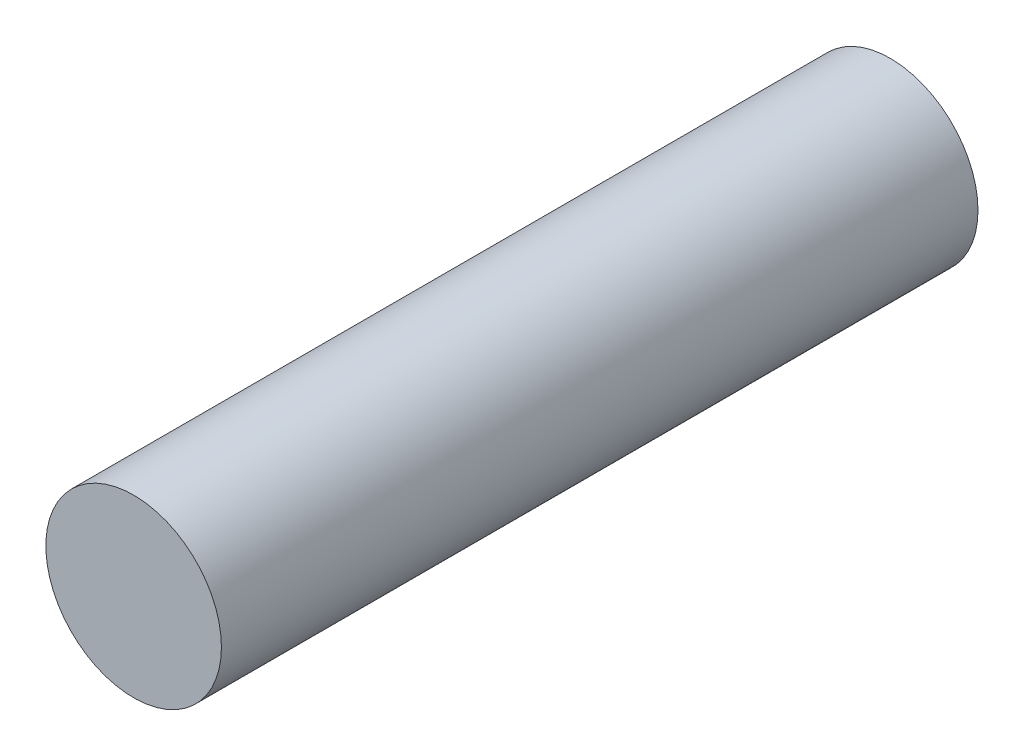
ISO-10303-21;
HEADER;
FILE_DESCRIPTION(('STEP AP214'),'2;1');
FILE_NAME('part.step','',(''),(''),'','','');
FILE_SCHEMA(('AUTOMOTIVE_DESIGN { 1 0 10303 214 1 1 1 1 }'));
ENDSEC;
DATA;
#1=APPLICATION_CONTEXT('core data for automotive mechanical design processes');
#2=APPLICATION_PROTOCOL_DEFINITION('international standard','automotive_design',2000,#1);
#3=PRODUCT_CONTEXT('',#1,'mechanical');
#4=PRODUCT('Part','Part','',(#3));
#5=PRODUCT_RELATED_PRODUCT_CATEGORY('part','',(#4));
#6=PRODUCT_DEFINITION_FORMATION('','',#4);
#7=PRODUCT_DEFINITION_CONTEXT('part definition',#1,'design');
#8=PRODUCT_DEFINITION('design','',#6,#7);
#9=PRODUCT_DEFINITION_SHAPE('','',#8);
#10=(LENGTH_UNIT() NAMED_UNIT(*) SI_UNIT(.MILLI.,.METRE.));
#11=(NAMED_UNIT(*) PLANE_ANGLE_UNIT() SI_UNIT($,.RADIAN.));
#12=(NAMED_UNIT(*) SI_UNIT($,.STERADIAN.) SOLID_ANGLE_UNIT());
#13=UNCERTAINTY_MEASURE_WITH_UNIT(LENGTH_MEASURE(1.E-05),#10,'distance_accuracy_value','');
#14=(GEOMETRIC_REPRESENTATION_CONTEXT(3) GLOBAL_UNCERTAINTY_ASSIGNED_CONTEXT((#13)) GLOBAL_UNIT_ASSIGNED_CONTEXT((#10,
#11,#12)) REPRESENTATION_CONTEXT('',''));
#15=CARTESIAN_POINT('',(0.,0.,0.));
#16=DIRECTION('',(0.,0.,1.));
#17=DIRECTION('',(1.,0.,0.));
#18=AXIS2_PLACEMENT_3D('',#15,#16,#17);
#19=CARTESIAN_POINT('',(25.493,16.8,-26.1489898732233));
#20=DIRECTION('',(0.,0.,1.));
#21=DIRECTION('',(1.,0.,0.));
#22=AXIS2_PLACEMENT_3D('',#19,#20,#21);
#23=CYLINDRICAL_SURFACE('',#22,7.);
#24=CARTESIAN_POINT('',(25.493,16.8,-6.35));
#25=DIRECTION('',(0.,0.,1.));
#26=DIRECTION('',(1.,0.,0.));
#27=AXIS2_PLACEMENT_3D('',#24,#25,#26);
#28=CIRCLE('',#27,7.);
#29=CARTESIAN_POINT('',(32.493,16.8,-6.35));
#30=VERTEX_POINT('',#29);
#31=EDGE_CURVE('E10',#30,#30,#28,.F.);
#32=ORIENTED_EDGE('',*,*,#31,.F.);
#33=EDGE_LOOP('',(#32));
#34=FACE_BOUND('',#33,.T.);
#35=CARTESIAN_POINT('',(25.493,16.8,53.975));
#36=DIRECTION('',(0.,0.,1.));
#37=DIRECTION('',(1.,0.,0.));
#38=AXIS2_PLACEMENT_3D('',#35,#36,#37);
#39=CIRCLE('',#38,7.);
#40=CARTESIAN_POINT('',(32.493,16.8,53.975));
#41=VERTEX_POINT('',#40);
#42=EDGE_CURVE('E49',#41,#41,#39,.T.);
#43=ORIENTED_EDGE('',*,*,#42,.F.);
#44=EDGE_LOOP('',(#43));
#45=FACE_BOUND('',#44,.T.);
#46=ADVANCED_FACE('F43',(#34,#45),#23,.T.);
#47=CARTESIAN_POINT('',(0.,0.,-6.35));
#48=DIRECTION('',(0.,0.,1.));
#49=DIRECTION('',(1.,0.,0.));
#50=AXIS2_PLACEMENT_3D('',#47,#48,#49);
#51=PLANE('',#50);
#52=ORIENTED_EDGE('',*,*,#31,.T.);
#53=EDGE_LOOP('',(#52));
#54=FACE_BOUND('',#53,.T.);
#55=ADVANCED_FACE('F58',(#54),#51,.F.);
#56=CARTESIAN_POINT('',(25.493,16.8,53.975));
#57=DIRECTION('',(0.,0.,1.));
#58=DIRECTION('',(1.,0.,0.));
#59=AXIS2_PLACEMENT_3D('',#56,#57,#58);
#60=PLANE('',#59);
#61=ORIENTED_EDGE('',*,*,#42,.T.);
#62=EDGE_LOOP('',(#61));
#63=FACE_BOUND('',#62,.T.);
#64=ADVANCED_FACE('F55',(#63),#60,.T.);
#65=CLOSED_SHELL('',(#46,#55,#64));
#66=MANIFOLD_SOLID_BREP('B2',#65);
#67=ADVANCED_BREP_SHAPE_REPRESENTATION('',(#18,#66),#14);
#68=SHAPE_DEFINITION_REPRESENTATION(#9,#67);
ENDSEC;
END-ISO-10303-21;
